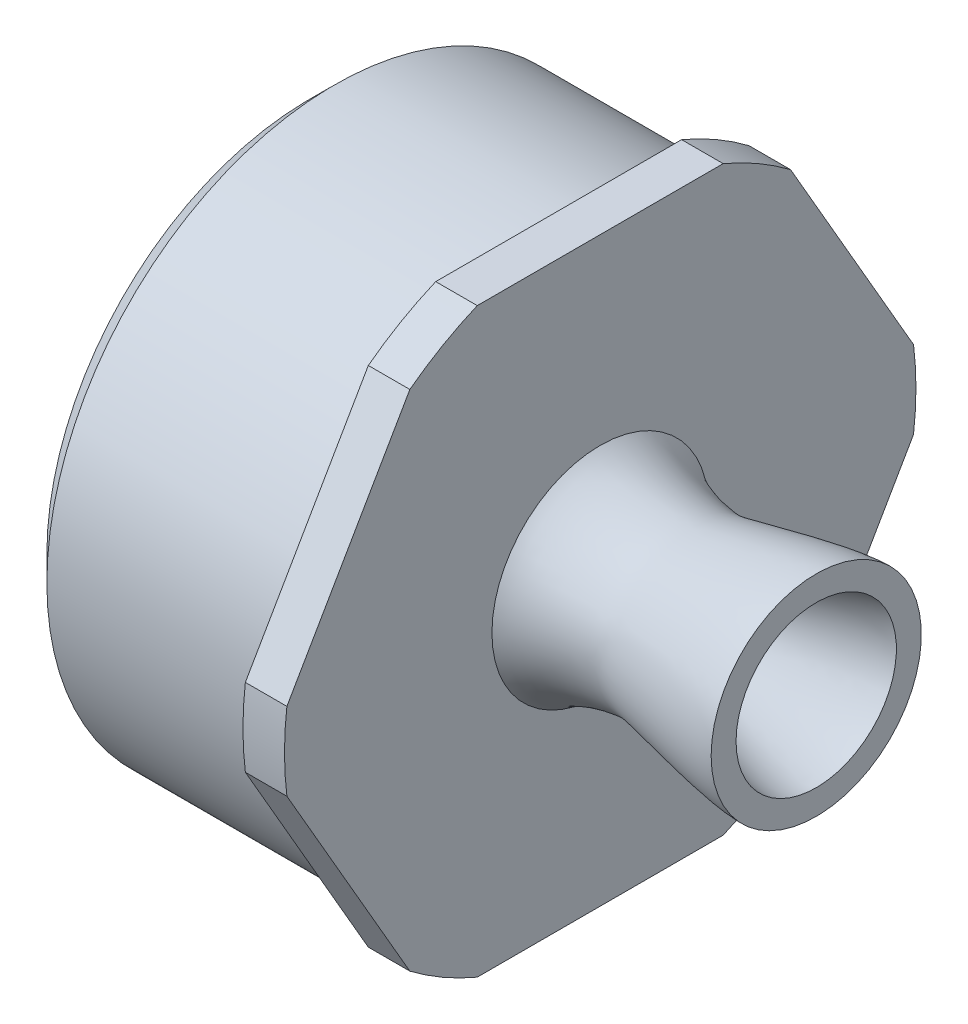
ISO-10303-21;
HEADER;
FILE_DESCRIPTION(('STEP AP214'),'2;1');
FILE_NAME('part.step','',(''),(''),'','','');
FILE_SCHEMA(('AUTOMOTIVE_DESIGN { 1 0 10303 214 1 1 1 1 }'));
ENDSEC;
DATA;
#1=APPLICATION_CONTEXT('core data for automotive mechanical design processes');
#2=APPLICATION_PROTOCOL_DEFINITION('international standard','automotive_design',2000,#1);
#3=PRODUCT_CONTEXT('',#1,'mechanical');
#4=PRODUCT('Part','Part','',(#3));
#5=PRODUCT_RELATED_PRODUCT_CATEGORY('part','',(#4));
#6=PRODUCT_DEFINITION_FORMATION('','',#4);
#7=PRODUCT_DEFINITION_CONTEXT('part definition',#1,'design');
#8=PRODUCT_DEFINITION('design','',#6,#7);
#9=PRODUCT_DEFINITION_SHAPE('','',#8);
#10=(LENGTH_UNIT() NAMED_UNIT(*) SI_UNIT(.MILLI.,.METRE.));
#11=(NAMED_UNIT(*) PLANE_ANGLE_UNIT() SI_UNIT($,.RADIAN.));
#12=(NAMED_UNIT(*) SI_UNIT($,.STERADIAN.) SOLID_ANGLE_UNIT());
#13=UNCERTAINTY_MEASURE_WITH_UNIT(LENGTH_MEASURE(1.E-05),#10,'distance_accuracy_value','');
#14=(GEOMETRIC_REPRESENTATION_CONTEXT(3) GLOBAL_UNCERTAINTY_ASSIGNED_CONTEXT((#13)) GLOBAL_UNIT_ASSIGNED_CONTEXT((#10,
#11,#12)) REPRESENTATION_CONTEXT('',''));
#15=CARTESIAN_POINT('',(0.,0.,0.));
#16=DIRECTION('',(0.,0.,1.));
#17=DIRECTION('',(1.,0.,0.));
#18=AXIS2_PLACEMENT_3D('',#15,#16,#17);
#19=CARTESIAN_POINT('',(0.,0.,0.));
#20=DIRECTION('',(-1.,0.,0.));
#21=DIRECTION('',(0.,0.,1.));
#22=AXIS2_PLACEMENT_3D('',#19,#20,#21);
#23=CYLINDRICAL_SURFACE('',#22,38.);
#24=DIRECTION('',(1.,0.,0.));
#25=VECTOR('',#24,1.);
#26=CARTESIAN_POINT('',(-0.001000000000001,4.68399438202417,37.7102134259297));
#27=LINE('',#26,#25);
#28=CARTESIAN_POINT('',(30.,4.68399438202419,37.7102134259297));
#29=VERTEX_POINT('',#28);
#30=CARTESIAN_POINT('',(35.,4.68399438202417,37.7102134259297));
#31=VERTEX_POINT('',#30);
#32=EDGE_CURVE('E298',#29,#31,#27,.T.);
#33=ORIENTED_EDGE('',*,*,#32,.F.);
#34=CARTESIAN_POINT('',(30.,0.,0.));
#35=DIRECTION('',(-1.,0.,0.));
#36=DIRECTION('',(0.,0.,1.));
#37=AXIS2_PLACEMENT_3D('',#34,#35,#36);
#38=CIRCLE('',#37,38.);
#39=CARTESIAN_POINT('',(30.,-4.68399438202336,37.7102134259298));
#40=VERTEX_POINT('',#39);
#41=EDGE_CURVE('E357',#40,#29,#38,.T.);
#42=ORIENTED_EDGE('',*,*,#41,.F.);
#43=DIRECTION('',(1.,0.,0.));
#44=VECTOR('',#43,1.);
#45=CARTESIAN_POINT('',(-0.001000000000001,-4.68399438202338,37.7102134259298));
#46=LINE('',#45,#44);
#47=CARTESIAN_POINT('',(35.,-4.68399438202338,37.7102134259298));
#48=VERTEX_POINT('',#47);
#49=EDGE_CURVE('E67',#40,#48,#46,.T.);
#50=ORIENTED_EDGE('',*,*,#49,.T.);
#51=CARTESIAN_POINT('',(35.,0.,0.));
#52=DIRECTION('',(-1.,0.,0.));
#53=DIRECTION('',(0.,0.,1.));
#54=AXIS2_PLACEMENT_3D('',#51,#52,#53);
#55=CIRCLE('',#54,38.);
#56=EDGE_CURVE('E347',#48,#31,#55,.T.);
#57=ORIENTED_EDGE('',*,*,#56,.T.);
#58=EDGE_LOOP('',(#33,#42,#50,#57));
#59=FACE_BOUND('',#58,.T.);
#60=ADVANCED_FACE('F43',(#59),#23,.T.);
#61=DIRECTION('',(1.,0.,0.));
#62=VECTOR('',#61,1.);
#63=CARTESIAN_POINT('',(-0.001000000000001,-30.3160056179761,22.9115648389813));
#64=LINE('',#63,#62);
#65=CARTESIAN_POINT('',(30.,-30.3160056179761,22.9115648389813));
#66=VERTEX_POINT('',#65);
#67=CARTESIAN_POINT('',(35.,-30.3160056179761,22.9115648389813));
#68=VERTEX_POINT('',#67);
#69=EDGE_CURVE('E310',#66,#68,#64,.T.);
#70=ORIENTED_EDGE('',*,*,#69,.F.);
#71=CARTESIAN_POINT('',(30.,-35.,14.7986485869487));
#72=VERTEX_POINT('',#71);
#73=EDGE_CURVE('E170',#72,#66,#38,.T.);
#74=ORIENTED_EDGE('',*,*,#73,.F.);
#75=DIRECTION('',(1.,0.,0.));
#76=VECTOR('',#75,1.);
#77=CARTESIAN_POINT('',(-0.001000000000001,-35.,14.7986485869487));
#78=LINE('',#77,#76);
#79=CARTESIAN_POINT('',(35.,-35.,14.7986485869487));
#80=VERTEX_POINT('',#79);
#81=EDGE_CURVE('E321',#72,#80,#78,.T.);
#82=ORIENTED_EDGE('',*,*,#81,.T.);
#83=EDGE_CURVE('E343',#80,#68,#55,.T.);
#84=ORIENTED_EDGE('',*,*,#83,.T.);
#85=EDGE_LOOP('',(#70,#74,#82,#84));
#86=FACE_BOUND('',#85,.T.);
#87=ADVANCED_FACE('F238',(#86),#23,.T.);
#88=DIRECTION('',(1.,0.,0.));
#89=VECTOR('',#88,1.);
#90=CARTESIAN_POINT('',(-0.001000000000001,-35.,-14.7986485869487));
#91=LINE('',#90,#89);
#92=CARTESIAN_POINT('',(30.,-35.,-14.7986485869487));
#93=VERTEX_POINT('',#92);
#94=CARTESIAN_POINT('',(35.,-35.,-14.7986485869487));
#95=VERTEX_POINT('',#94);
#96=EDGE_CURVE('E322',#93,#95,#91,.T.);
#97=ORIENTED_EDGE('',*,*,#96,.F.);
#98=CARTESIAN_POINT('',(30.,-30.3160056179764,-22.9115648389809));
#99=VERTEX_POINT('',#98);
#100=EDGE_CURVE('E164',#99,#93,#38,.T.);
#101=ORIENTED_EDGE('',*,*,#100,.F.);
#102=DIRECTION('',(1.,0.,0.));
#103=VECTOR('',#102,1.);
#104=CARTESIAN_POINT('',(-0.001000000000001,-30.3160056179764,-22.9115648389809));
#105=LINE('',#104,#103);
#106=CARTESIAN_POINT('',(35.,-30.3160056179764,-22.9115648389809));
#107=VERTEX_POINT('',#106);
#108=EDGE_CURVE('E138',#99,#107,#105,.T.);
#109=ORIENTED_EDGE('',*,*,#108,.T.);
#110=EDGE_CURVE('E337',#107,#95,#55,.T.);
#111=ORIENTED_EDGE('',*,*,#110,.T.);
#112=EDGE_LOOP('',(#97,#101,#109,#111));
#113=FACE_BOUND('',#112,.T.);
#114=ADVANCED_FACE('F244',(#113),#23,.T.);
#115=DIRECTION('',(1.,0.,0.));
#116=VECTOR('',#115,1.);
#117=CARTESIAN_POINT('',(-0.001000000000001,-4.68399438202391,-37.7102134259297));
#118=LINE('',#117,#116);
#119=CARTESIAN_POINT('',(30.,-4.68399438202396,-37.7102134259297));
#120=VERTEX_POINT('',#119);
#121=CARTESIAN_POINT('',(35.,-4.68399438202391,-37.7102134259297));
#122=VERTEX_POINT('',#121);
#123=EDGE_CURVE('E135',#120,#122,#118,.T.);
#124=ORIENTED_EDGE('',*,*,#123,.F.);
#125=CARTESIAN_POINT('',(30.,4.68399438202366,-37.7102134259297));
#126=VERTEX_POINT('',#125);
#127=EDGE_CURVE('E151',#126,#120,#38,.T.);
#128=ORIENTED_EDGE('',*,*,#127,.F.);
#129=DIRECTION('',(1.,0.,0.));
#130=VECTOR('',#129,1.);
#131=CARTESIAN_POINT('',(-0.001000000000001,4.68399438202365,-37.7102134259297));
#132=LINE('',#131,#130);
#133=CARTESIAN_POINT('',(35.,4.68399438202365,-37.7102134259297));
#134=VERTEX_POINT('',#133);
#135=EDGE_CURVE('E269',#126,#134,#132,.T.);
#136=ORIENTED_EDGE('',*,*,#135,.T.);
#137=EDGE_CURVE('E153',#134,#122,#55,.T.);
#138=ORIENTED_EDGE('',*,*,#137,.T.);
#139=EDGE_LOOP('',(#124,#128,#136,#138));
#140=FACE_BOUND('',#139,.T.);
#141=ADVANCED_FACE('F149',(#140),#23,.T.);
#142=DIRECTION('',(1.,0.,0.));
#143=VECTOR('',#142,1.);
#144=CARTESIAN_POINT('',(-0.001000000000001,30.3160056179762,-22.9115648389811));
#145=LINE('',#144,#143);
#146=CARTESIAN_POINT('',(30.,30.3160056179762,-22.9115648389811));
#147=VERTEX_POINT('',#146);
#148=CARTESIAN_POINT('',(35.,30.3160056179762,-22.9115648389811));
#149=VERTEX_POINT('',#148);
#150=EDGE_CURVE('E263',#147,#149,#145,.T.);
#151=ORIENTED_EDGE('',*,*,#150,.F.);
#152=CARTESIAN_POINT('',(30.,35.,-14.7986485869487));
#153=VERTEX_POINT('',#152);
#154=EDGE_CURVE('E163',#153,#147,#38,.T.);
#155=ORIENTED_EDGE('',*,*,#154,.F.);
#156=DIRECTION('',(1.,0.,0.));
#157=VECTOR('',#156,1.);
#158=CARTESIAN_POINT('',(-0.001000000000001,35.,-14.7986485869487));
#159=LINE('',#158,#157);
#160=CARTESIAN_POINT('',(35.,35.,-14.7986485869487));
#161=VERTEX_POINT('',#160);
#162=EDGE_CURVE('E213',#153,#161,#159,.T.);
#163=ORIENTED_EDGE('',*,*,#162,.T.);
#164=EDGE_CURVE('E175',#161,#149,#55,.T.);
#165=ORIENTED_EDGE('',*,*,#164,.T.);
#166=EDGE_LOOP('',(#151,#155,#163,#165));
#167=FACE_BOUND('',#166,.T.);
#168=ADVANCED_FACE('F200',(#167),#23,.T.);
#169=CARTESIAN_POINT('',(0.,0.,0.));
#170=DIRECTION('',(1.,0.,0.));
#171=DIRECTION('',(0.,0.,-1.));
#172=AXIS2_PLACEMENT_3D('',#169,#170,#171);
#173=PLANE('',#172);
#174=CARTESIAN_POINT('',(0.,0.,0.));
#175=DIRECTION('',(-1.,0.,0.));
#176=DIRECTION('',(0.,0.,1.));
#177=AXIS2_PLACEMENT_3D('',#174,#175,#176);
#178=CIRCLE('',#177,28.6);
#179=CARTESIAN_POINT('',(0.,0.,28.6));
#180=VERTEX_POINT('',#179);
#181=EDGE_CURVE('E11',#180,#180,#178,.T.);
#182=ORIENTED_EDGE('',*,*,#181,.F.);
#183=EDGE_LOOP('',(#182));
#184=FACE_BOUND('',#183,.T.);
#185=CARTESIAN_POINT('',(0.,0.,0.));
#186=DIRECTION('',(-1.,0.,0.));
#187=DIRECTION('',(0.,0.,1.));
#188=AXIS2_PLACEMENT_3D('',#185,#186,#187);
#189=CIRCLE('',#188,31.6);
#190=CARTESIAN_POINT('',(0.,0.,31.6));
#191=VERTEX_POINT('',#190);
#192=EDGE_CURVE('E203',#191,#191,#189,.T.);
#193=ORIENTED_EDGE('',*,*,#192,.T.);
#194=EDGE_LOOP('',(#193));
#195=FACE_BOUND('',#194,.T.);
#196=ADVANCED_FACE('F45',(#184,#195),#173,.F.);
#197=CARTESIAN_POINT('',(0.,0.,-28.6));
#198=CARTESIAN_POINT('',(20.3139189696582,0.,-8.95615601012278));
#199=CARTESIAN_POINT('',(43.7845833731386,0.,-4.83535707226768));
#200=CARTESIAN_POINT('',(46.6782523647696,0.,-5.00429715983611));
#201=CARTESIAN_POINT('',(57.2916092333504,0.,-9.66196612620218));
#202=CARTESIAN_POINT('',(61.,0.,-9.65));
#203=B_SPLINE_CURVE_WITH_KNOTS('',3,(#197,#198,#199,#200,#201,#202),.UNSPECIFIED.,.F.,.F.,(4,1,
1,4),(0.,0.41642223388949,0.51642223388949,1.),.UNSPECIFIED.);
#204=CARTESIAN_POINT('',(0.,0.,0.));
#205=DIRECTION('',(-1.,0.,0.));
#206=AXIS1_PLACEMENT('',#204,#205);
#207=SURFACE_OF_REVOLUTION('',#203,#206);
#208=CARTESIAN_POINT('',(61.,0.,0.));
#209=DIRECTION('',(-1.,0.,0.));
#210=DIRECTION('',(0.,0.,1.));
#211=AXIS2_PLACEMENT_3D('',#208,#209,#210);
#212=CIRCLE('',#211,9.65);
#213=CARTESIAN_POINT('',(61.,0.,9.65));
#214=VERTEX_POINT('',#213);
#215=EDGE_CURVE('E52',#214,#214,#212,.T.);
#216=ORIENTED_EDGE('',*,*,#215,.F.);
#217=EDGE_LOOP('',(#216));
#218=FACE_BOUND('',#217,.T.);
#219=ORIENTED_EDGE('',*,*,#181,.T.);
#220=EDGE_LOOP('',(#219));
#221=FACE_BOUND('',#220,.T.);
#222=ADVANCED_FACE('F193',(#218,#221),#207,.T.);
#223=CARTESIAN_POINT('',(61.,0.,-1.4109084271278E-13));
#224=DIRECTION('',(1.,0.,0.));
#225=DIRECTION('',(0.,0.,-1.));
#226=AXIS2_PLACEMENT_3D('',#223,#224,#225);
#227=PLANE('',#226);
#228=ORIENTED_EDGE('',*,*,#215,.T.);
#229=EDGE_LOOP('',(#228));
#230=FACE_BOUND('',#229,.T.);
#231=CARTESIAN_POINT('',(61.,0.,0.));
#232=DIRECTION('',(-1.,0.,0.));
#233=DIRECTION('',(0.,0.,1.));
#234=AXIS2_PLACEMENT_3D('',#231,#232,#233);
#235=CIRCLE('',#234,12.65);
#236=CARTESIAN_POINT('',(61.,0.,12.65));
#237=VERTEX_POINT('',#236);
#238=EDGE_CURVE('E183',#237,#237,#235,.T.);
#239=ORIENTED_EDGE('',*,*,#238,.F.);
#240=EDGE_LOOP('',(#239));
#241=FACE_BOUND('',#240,.T.);
#242=ADVANCED_FACE('F190',(#230,#241),#227,.T.);
#243=CARTESIAN_POINT('',(35.,0.,-13.0344809775708));
#244=CARTESIAN_POINT('',(38.1086759574543,0.,-10.6485345912274));
#245=CARTESIAN_POINT('',(43.8355084577904,0.,-9.8617532345596));
#246=CARTESIAN_POINT('',(46.5985499948104,0.,-10.0407453887266));
#247=CARTESIAN_POINT('',(57.2649393478371,0.,-12.6502018355611));
#248=CARTESIAN_POINT('',(61.,0.,-12.65));
#249=B_SPLINE_CURVE_WITH_KNOTS('',3,(#243,#244,#245,#246,#247,#248),.UNSPECIFIED.,.F.,.F.,(4,1,
1,4),(0.,0.394117419698885,0.494117419698885,1.),.UNSPECIFIED.);
#250=CARTESIAN_POINT('',(0.,0.,0.));
#251=DIRECTION('',(-1.,0.,0.));
#252=AXIS1_PLACEMENT('',#250,#251);
#253=SURFACE_OF_REVOLUTION('',#249,#252);
#254=ORIENTED_EDGE('',*,*,#238,.T.);
#255=EDGE_LOOP('',(#254));
#256=FACE_BOUND('',#255,.T.);
#257=CARTESIAN_POINT('',(35.,0.,0.));
#258=DIRECTION('',(-1.,0.,0.));
#259=DIRECTION('',(0.,0.,1.));
#260=AXIS2_PLACEMENT_3D('',#257,#258,#259);
#261=CIRCLE('',#260,13.0344809775708);
#262=CARTESIAN_POINT('',(35.,0.,13.0344809775708));
#263=VERTEX_POINT('',#262);
#264=EDGE_CURVE('E179',#263,#263,#261,.T.);
#265=ORIENTED_EDGE('',*,*,#264,.F.);
#266=EDGE_LOOP('',(#265));
#267=FACE_BOUND('',#266,.T.);
#268=ADVANCED_FACE('F227',(#256,#267),#253,.F.);
#269=CARTESIAN_POINT('',(35.,0.,0.));
#270=DIRECTION('',(1.,0.,0.));
#271=DIRECTION('',(0.,0.,-1.));
#272=AXIS2_PLACEMENT_3D('',#269,#270,#271);
#273=PLANE('',#272);
#274=DIRECTION('',(0.,0.866025403784433,-0.50000000000001));
#275=VECTOR('',#274,1.);
#276=CARTESIAN_POINT('',(35.,4.68399438202417,37.7102134259297));
#277=LINE('',#276,#275);
#278=CARTESIAN_POINT('',(35.,30.3160056179765,22.9115648389807));
#279=VERTEX_POINT('',#278);
#280=EDGE_CURVE('E301',#31,#279,#277,.T.);
#281=ORIENTED_EDGE('',*,*,#280,.F.);
#282=ORIENTED_EDGE('',*,*,#56,.F.);
#283=DIRECTION('',(0.,0.866025403784443,0.499999999999992));
#284=VECTOR('',#283,1.);
#285=CARTESIAN_POINT('',(35.,-30.3160056179761,22.9115648389813));
#286=LINE('',#285,#284);
#287=EDGE_CURVE('E297',#68,#48,#286,.T.);
#288=ORIENTED_EDGE('',*,*,#287,.F.);
#289=ORIENTED_EDGE('',*,*,#83,.F.);
#290=DIRECTION('',(0.,0.,1.));
#291=VECTOR('',#290,1.);
#292=CARTESIAN_POINT('',(35.,-35.,-14.7986485869487));
#293=LINE('',#292,#291);
#294=EDGE_CURVE('E309',#95,#80,#293,.T.);
#295=ORIENTED_EDGE('',*,*,#294,.F.);
#296=ORIENTED_EDGE('',*,*,#110,.F.);
#297=DIRECTION('',(0.,-0.866025403784436,0.500000000000004));
#298=VECTOR('',#297,1.);
#299=CARTESIAN_POINT('',(35.,-4.68399438202391,-37.7102134259297));
#300=LINE('',#299,#298);
#301=EDGE_CURVE('E155',#122,#107,#300,.T.);
#302=ORIENTED_EDGE('',*,*,#301,.F.);
#303=ORIENTED_EDGE('',*,*,#137,.F.);
#304=DIRECTION('',(0.,-0.86602540378444,-0.499999999999998));
#305=VECTOR('',#304,1.);
#306=CARTESIAN_POINT('',(35.,30.3160056179762,-22.9115648389811));
#307=LINE('',#306,#305);
#308=EDGE_CURVE('E144',#149,#134,#307,.T.);
#309=ORIENTED_EDGE('',*,*,#308,.F.);
#310=ORIENTED_EDGE('',*,*,#164,.F.);
#311=DIRECTION('',(0.,0.,-1.));
#312=VECTOR('',#311,1.);
#313=CARTESIAN_POINT('',(35.,35.,14.7986485869487));
#314=LINE('',#313,#312);
#315=CARTESIAN_POINT('',(35.,35.,14.7986485869487));
#316=VERTEX_POINT('',#315);
#317=EDGE_CURVE('E281',#316,#161,#314,.T.);
#318=ORIENTED_EDGE('',*,*,#317,.F.);
#319=EDGE_CURVE('E168',#279,#316,#55,.T.);
#320=ORIENTED_EDGE('',*,*,#319,.F.);
#321=EDGE_LOOP('',(#281,#282,#288,#289,#295,#296,#302,#303,#309,#310,#318,#320));
#322=FACE_BOUND('',#321,.T.);
#323=ORIENTED_EDGE('',*,*,#264,.T.);
#324=EDGE_LOOP('',(#323));
#325=FACE_BOUND('',#324,.T.);
#326=ADVANCED_FACE('F231',(#322,#325),#273,.T.);
#327=DIRECTION('',(1.,0.,0.));
#328=VECTOR('',#327,1.);
#329=CARTESIAN_POINT('',(-0.001000000000001,30.3160056179765,22.9115648389807));
#330=LINE('',#329,#328);
#331=CARTESIAN_POINT('',(30.,30.3160056179765,22.9115648389807));
#332=VERTEX_POINT('',#331);
#333=EDGE_CURVE('E59',#332,#279,#330,.T.);
#334=ORIENTED_EDGE('',*,*,#333,.T.);
#335=ORIENTED_EDGE('',*,*,#319,.T.);
#336=DIRECTION('',(1.,0.,0.));
#337=VECTOR('',#336,1.);
#338=CARTESIAN_POINT('',(-0.001000000000001,35.,14.7986485869487));
#339=LINE('',#338,#337);
#340=CARTESIAN_POINT('',(30.,35.,14.7986485869487));
#341=VERTEX_POINT('',#340);
#342=EDGE_CURVE('E277',#341,#316,#339,.T.);
#343=ORIENTED_EDGE('',*,*,#342,.F.);
#344=EDGE_CURVE('E169',#332,#341,#38,.T.);
#345=ORIENTED_EDGE('',*,*,#344,.F.);
#346=EDGE_LOOP('',(#334,#335,#343,#345));
#347=FACE_BOUND('',#346,.T.);
#348=ADVANCED_FACE('F240',(#347),#23,.T.);
#349=CARTESIAN_POINT('',(30.,0.,0.));
#350=DIRECTION('',(-1.,0.,0.));
#351=DIRECTION('',(0.,0.,1.));
#352=AXIS2_PLACEMENT_3D('',#349,#350,#351);
#353=PLANE('',#352);
#354=DIRECTION('',(0.,0.866025403784433,-0.50000000000001));
#355=VECTOR('',#354,1.);
#356=CARTESIAN_POINT('',(30.,4.68399438202417,37.7102134259297));
#357=LINE('',#356,#355);
#358=EDGE_CURVE('E294',#29,#332,#357,.T.);
#359=ORIENTED_EDGE('',*,*,#358,.T.);
#360=ORIENTED_EDGE('',*,*,#344,.T.);
#361=DIRECTION('',(0.,0.,-1.));
#362=VECTOR('',#361,1.);
#363=CARTESIAN_POINT('',(30.,35.,14.7986485869487));
#364=LINE('',#363,#362);
#365=EDGE_CURVE('E207',#341,#153,#364,.T.);
#366=ORIENTED_EDGE('',*,*,#365,.T.);
#367=ORIENTED_EDGE('',*,*,#154,.T.);
#368=DIRECTION('',(0.,-0.86602540378444,-0.499999999999998));
#369=VECTOR('',#368,1.);
#370=CARTESIAN_POINT('',(30.,30.3160056179762,-22.9115648389811));
#371=LINE('',#370,#369);
#372=EDGE_CURVE('E161',#147,#126,#371,.T.);
#373=ORIENTED_EDGE('',*,*,#372,.T.);
#374=ORIENTED_EDGE('',*,*,#127,.T.);
#375=DIRECTION('',(0.,-0.866025403784436,0.500000000000004));
#376=VECTOR('',#375,1.);
#377=CARTESIAN_POINT('',(30.,-4.68399438202391,-37.7102134259297));
#378=LINE('',#377,#376);
#379=EDGE_CURVE('E132',#120,#99,#378,.T.);
#380=ORIENTED_EDGE('',*,*,#379,.T.);
#381=ORIENTED_EDGE('',*,*,#100,.T.);
#382=DIRECTION('',(0.,0.,1.));
#383=VECTOR('',#382,1.);
#384=CARTESIAN_POINT('',(30.,-35.,-14.7986485869487));
#385=LINE('',#384,#383);
#386=EDGE_CURVE('E317',#93,#72,#385,.T.);
#387=ORIENTED_EDGE('',*,*,#386,.T.);
#388=ORIENTED_EDGE('',*,*,#73,.T.);
#389=DIRECTION('',(0.,0.866025403784443,0.499999999999992));
#390=VECTOR('',#389,1.);
#391=CARTESIAN_POINT('',(30.,-30.3160056179761,22.9115648389813));
#392=LINE('',#391,#390);
#393=EDGE_CURVE('E306',#66,#40,#392,.T.);
#394=ORIENTED_EDGE('',*,*,#393,.T.);
#395=ORIENTED_EDGE('',*,*,#41,.T.);
#396=EDGE_LOOP('',(#359,#360,#366,#367,#373,#374,#380,#381,#387,#388,#394,#395));
#397=FACE_BOUND('',#396,.T.);
#398=CARTESIAN_POINT('',(30.,0.,0.));
#399=DIRECTION('',(-1.,0.,0.));
#400=DIRECTION('',(0.,0.,1.));
#401=AXIS2_PLACEMENT_3D('',#398,#399,#400);
#402=CIRCLE('',#401,34.6);
#403=CARTESIAN_POINT('',(30.,0.,34.6));
#404=VERTEX_POINT('',#403);
#405=EDGE_CURVE('E173',#404,#404,#402,.T.);
#406=ORIENTED_EDGE('',*,*,#405,.F.);
#407=EDGE_LOOP('',(#406));
#408=FACE_BOUND('',#407,.T.);
#409=ADVANCED_FACE('F158',(#397,#408),#353,.T.);
#410=CARTESIAN_POINT('',(0.,0.,0.));
#411=DIRECTION('',(-1.,0.,0.));
#412=DIRECTION('',(0.,0.,1.));
#413=AXIS2_PLACEMENT_3D('',#410,#411,#412);
#414=CYLINDRICAL_SURFACE('',#413,34.6);
#415=ORIENTED_EDGE('',*,*,#405,.T.);
#416=EDGE_LOOP('',(#415));
#417=FACE_BOUND('',#416,.T.);
#418=CARTESIAN_POINT('',(3.00000000000001,0.,0.));
#419=DIRECTION('',(-1.,0.,0.));
#420=DIRECTION('',(0.,0.,1.));
#421=AXIS2_PLACEMENT_3D('',#418,#419,#420);
#422=CIRCLE('',#421,34.6);
#423=CARTESIAN_POINT('',(3.00000000000001,0.,34.6));
#424=VERTEX_POINT('',#423);
#425=EDGE_CURVE('E206',#424,#424,#422,.T.);
#426=ORIENTED_EDGE('',*,*,#425,.F.);
#427=EDGE_LOOP('',(#426));
#428=FACE_BOUND('',#427,.T.);
#429=ADVANCED_FACE('F254',(#417,#428),#414,.T.);
#430=CARTESIAN_POINT('',(0.,0.,0.));
#431=DIRECTION('',(1.,0.,0.));
#432=DIRECTION('',(0.,0.,-1.));
#433=AXIS2_PLACEMENT_3D('',#430,#431,#432);
#434=CONICAL_SURFACE('',#433,31.6,0.785398163397447);
#435=ORIENTED_EDGE('',*,*,#425,.T.);
#436=EDGE_LOOP('',(#435));
#437=FACE_BOUND('',#436,.T.);
#438=ORIENTED_EDGE('',*,*,#192,.F.);
#439=EDGE_LOOP('',(#438));
#440=FACE_BOUND('',#439,.T.);
#441=ADVANCED_FACE('F368',(#437,#440),#434,.T.);
#442=CARTESIAN_POINT('',(-0.001000000000001,35.,14.7986485869487));
#443=DIRECTION('',(0.,-1.,0.));
#444=DIRECTION('',(0.,0.,-1.));
#445=AXIS2_PLACEMENT_3D('',#442,#443,#444);
#446=PLANE('',#445);
#447=ORIENTED_EDGE('',*,*,#342,.T.);
#448=ORIENTED_EDGE('',*,*,#317,.T.);
#449=ORIENTED_EDGE('',*,*,#162,.F.);
#450=ORIENTED_EDGE('',*,*,#365,.F.);
#451=EDGE_LOOP('',(#447,#448,#449,#450));
#452=FACE_BOUND('',#451,.T.);
#453=ADVANCED_FACE('F276',(#452),#446,.F.);
#454=CARTESIAN_POINT('',(-0.001000000000001,30.3160056179762,-22.9115648389811));
#455=DIRECTION('',(0.,-0.499999999999998,0.86602540378444));
#456=DIRECTION('',(0.,-0.86602540378444,-0.499999999999998));
#457=AXIS2_PLACEMENT_3D('',#454,#455,#456);
#458=PLANE('',#457);
#459=ORIENTED_EDGE('',*,*,#150,.T.);
#460=ORIENTED_EDGE('',*,*,#308,.T.);
#461=ORIENTED_EDGE('',*,*,#135,.F.);
#462=ORIENTED_EDGE('',*,*,#372,.F.);
#463=EDGE_LOOP('',(#459,#460,#461,#462));
#464=FACE_BOUND('',#463,.T.);
#465=ADVANCED_FACE('F377',(#464),#458,.F.);
#466=CARTESIAN_POINT('',(-0.001000000000001,-4.68399438202391,-37.7102134259297));
#467=DIRECTION('',(0.,0.500000000000004,0.866025403784436));
#468=DIRECTION('',(0.,-0.866025403784436,0.500000000000004));
#469=AXIS2_PLACEMENT_3D('',#466,#467,#468);
#470=PLANE('',#469);
#471=ORIENTED_EDGE('',*,*,#123,.T.);
#472=ORIENTED_EDGE('',*,*,#301,.T.);
#473=ORIENTED_EDGE('',*,*,#108,.F.);
#474=ORIENTED_EDGE('',*,*,#379,.F.);
#475=EDGE_LOOP('',(#471,#472,#473,#474));
#476=FACE_BOUND('',#475,.T.);
#477=ADVANCED_FACE('F134',(#476),#470,.F.);
#478=CARTESIAN_POINT('',(-0.001000000000001,-35.,-14.7986485869487));
#479=DIRECTION('',(0.,1.,0.));
#480=DIRECTION('',(0.,0.,1.));
#481=AXIS2_PLACEMENT_3D('',#478,#479,#480);
#482=PLANE('',#481);
#483=ORIENTED_EDGE('',*,*,#96,.T.);
#484=ORIENTED_EDGE('',*,*,#294,.T.);
#485=ORIENTED_EDGE('',*,*,#81,.F.);
#486=ORIENTED_EDGE('',*,*,#386,.F.);
#487=EDGE_LOOP('',(#483,#484,#485,#486));
#488=FACE_BOUND('',#487,.T.);
#489=ADVANCED_FACE('F387',(#488),#482,.F.);
#490=CARTESIAN_POINT('',(-0.001000000000001,-30.3160056179761,22.9115648389813));
#491=DIRECTION('',(0.,0.499999999999992,-0.866025403784443));
#492=DIRECTION('',(0.,0.866025403784443,0.499999999999992));
#493=AXIS2_PLACEMENT_3D('',#490,#491,#492);
#494=PLANE('',#493);
#495=ORIENTED_EDGE('',*,*,#69,.T.);
#496=ORIENTED_EDGE('',*,*,#287,.T.);
#497=ORIENTED_EDGE('',*,*,#49,.F.);
#498=ORIENTED_EDGE('',*,*,#393,.F.);
#499=EDGE_LOOP('',(#495,#496,#497,#498));
#500=FACE_BOUND('',#499,.T.);
#501=ADVANCED_FACE('F384',(#500),#494,.F.);
#502=CARTESIAN_POINT('',(-0.001000000000001,4.68399438202417,37.7102134259297));
#503=DIRECTION('',(0.,-0.50000000000001,-0.866025403784433));
#504=DIRECTION('',(0.,0.866025403784433,-0.50000000000001));
#505=AXIS2_PLACEMENT_3D('',#502,#503,#504);
#506=PLANE('',#505);
#507=ORIENTED_EDGE('',*,*,#32,.T.);
#508=ORIENTED_EDGE('',*,*,#280,.T.);
#509=ORIENTED_EDGE('',*,*,#333,.F.);
#510=ORIENTED_EDGE('',*,*,#358,.F.);
#511=EDGE_LOOP('',(#507,#508,#509,#510));
#512=FACE_BOUND('',#511,.T.);
#513=ADVANCED_FACE('F356',(#512),#506,.F.);
#514=CLOSED_SHELL('',(#60,#87,#114,#141,#168,#196,#222,#242,#268,#326,#348,#409,#429,#441,#453,
#465,#477,#489,#501,#513));
#515=MANIFOLD_SOLID_BREP('B2',#514);
#516=ADVANCED_BREP_SHAPE_REPRESENTATION('',(#18,#515),#14);
#517=SHAPE_DEFINITION_REPRESENTATION(#9,#516);
ENDSEC;
END-ISO-10303-21;
